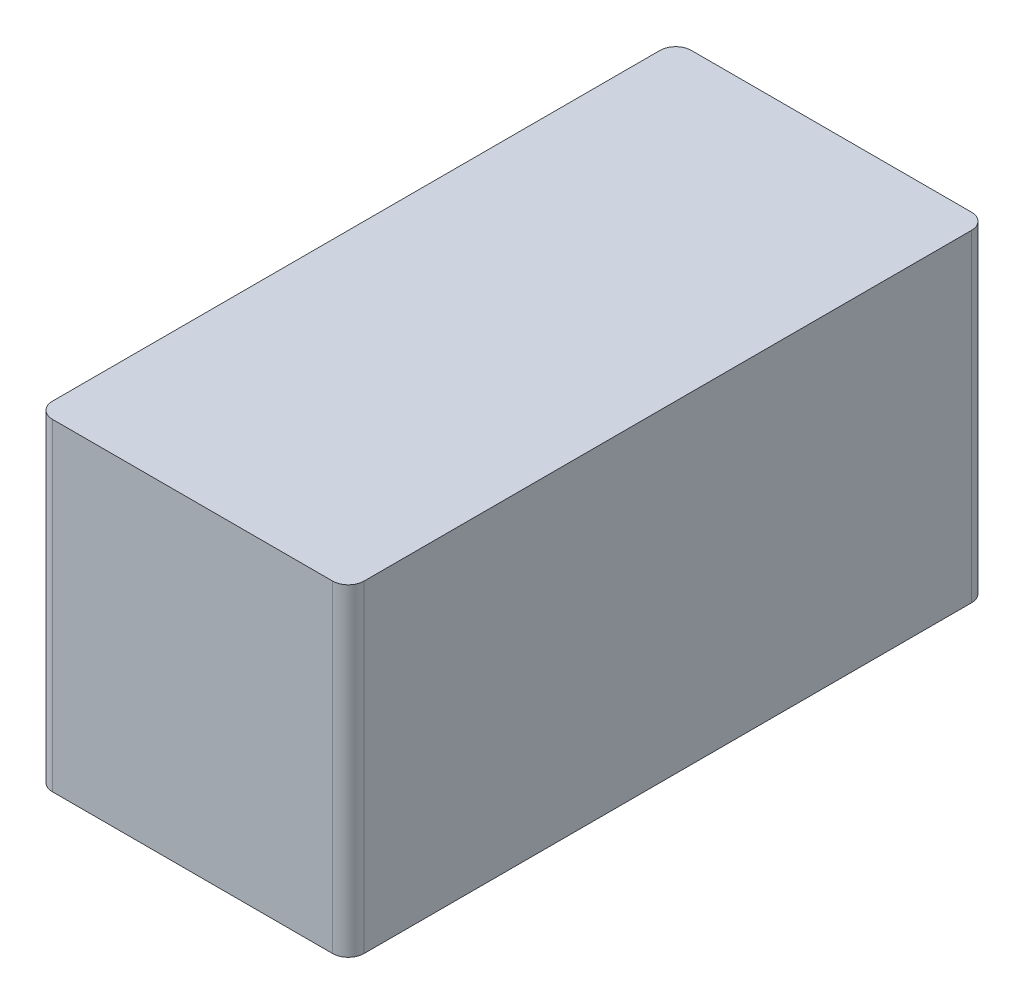
ISO-10303-21;
HEADER;
FILE_DESCRIPTION(('STEP AP214'),'2;1');
FILE_NAME('part.step','',(''),(''),'','','');
FILE_SCHEMA(('AUTOMOTIVE_DESIGN { 1 0 10303 214 1 1 1 1 }'));
ENDSEC;
DATA;
#1=APPLICATION_CONTEXT('core data for automotive mechanical design processes');
#2=APPLICATION_PROTOCOL_DEFINITION('international standard','automotive_design',2000,#1);
#3=PRODUCT_CONTEXT('',#1,'mechanical');
#4=PRODUCT('Part','Part','',(#3));
#5=PRODUCT_RELATED_PRODUCT_CATEGORY('part','',(#4));
#6=PRODUCT_DEFINITION_FORMATION('','',#4);
#7=PRODUCT_DEFINITION_CONTEXT('part definition',#1,'design');
#8=PRODUCT_DEFINITION('design','',#6,#7);
#9=PRODUCT_DEFINITION_SHAPE('','',#8);
#10=(LENGTH_UNIT() NAMED_UNIT(*) SI_UNIT(.MILLI.,.METRE.));
#11=(NAMED_UNIT(*) PLANE_ANGLE_UNIT() SI_UNIT($,.RADIAN.));
#12=(NAMED_UNIT(*) SI_UNIT($,.STERADIAN.) SOLID_ANGLE_UNIT());
#13=UNCERTAINTY_MEASURE_WITH_UNIT(LENGTH_MEASURE(1.E-05),#10,'distance_accuracy_value','');
#14=(GEOMETRIC_REPRESENTATION_CONTEXT(3) GLOBAL_UNCERTAINTY_ASSIGNED_CONTEXT((#13)) GLOBAL_UNIT_ASSIGNED_CONTEXT((#10,
#11,#12)) REPRESENTATION_CONTEXT('',''));
#15=CARTESIAN_POINT('',(0.,0.,0.));
#16=DIRECTION('',(0.,0.,1.));
#17=DIRECTION('',(1.,0.,0.));
#18=AXIS2_PLACEMENT_3D('',#15,#16,#17);
#19=CARTESIAN_POINT('',(9.9,10.25,-20.3));
#20=DIRECTION('',(-1.,0.,0.));
#21=DIRECTION('',(0.,0.,1.));
#22=AXIS2_PLACEMENT_3D('',#19,#20,#21);
#23=PLANE('',#22);
#24=DIRECTION('',(0.,0.,-1.));
#25=VECTOR('',#24,1.);
#26=CARTESIAN_POINT('',(9.9,-10.25,-20.3));
#27=LINE('',#26,#25);
#28=CARTESIAN_POINT('',(9.9,-10.25,19.3));
#29=VERTEX_POINT('',#28);
#30=CARTESIAN_POINT('',(9.9,-10.25,-19.3));
#31=VERTEX_POINT('',#30);
#32=EDGE_CURVE('E130',#29,#31,#27,.T.);
#33=ORIENTED_EDGE('',*,*,#32,.T.);
#34=DIRECTION('',(0.,-1.,0.));
#35=VECTOR('',#34,1.);
#36=CARTESIAN_POINT('',(9.9,10.25,-19.3));
#37=LINE('',#36,#35);
#38=CARTESIAN_POINT('',(9.9,10.25,-19.3));
#39=VERTEX_POINT('',#38);
#40=EDGE_CURVE('E153',#31,#39,#37,.F.);
#41=ORIENTED_EDGE('',*,*,#40,.T.);
#42=DIRECTION('',(0.,0.,-1.));
#43=VECTOR('',#42,1.);
#44=CARTESIAN_POINT('',(9.9,10.25,-20.3));
#45=LINE('',#44,#43);
#46=CARTESIAN_POINT('',(9.9,10.25,19.3));
#47=VERTEX_POINT('',#46);
#48=EDGE_CURVE('E128',#47,#39,#45,.T.);
#49=ORIENTED_EDGE('',*,*,#48,.F.);
#50=DIRECTION('',(0.,-1.,0.));
#51=VECTOR('',#50,1.);
#52=CARTESIAN_POINT('',(9.9,10.25,19.3));
#53=LINE('',#52,#51);
#54=EDGE_CURVE('E150',#47,#29,#53,.T.);
#55=ORIENTED_EDGE('',*,*,#54,.T.);
#56=EDGE_LOOP('',(#33,#41,#49,#55));
#57=FACE_BOUND('',#56,.T.);
#58=ADVANCED_FACE('F35',(#57),#23,.F.);
#59=CARTESIAN_POINT('',(-9.9,10.25,-20.3));
#60=DIRECTION('',(0.,0.,1.));
#61=DIRECTION('',(1.,0.,0.));
#62=AXIS2_PLACEMENT_3D('',#59,#60,#61);
#63=PLANE('',#62);
#64=DIRECTION('',(-1.,0.,0.));
#65=VECTOR('',#64,1.);
#66=CARTESIAN_POINT('',(-9.9,-10.25,-20.3));
#67=LINE('',#66,#65);
#68=CARTESIAN_POINT('',(8.9,-10.25,-20.3));
#69=VERTEX_POINT('',#68);
#70=CARTESIAN_POINT('',(-8.9,-10.25,-20.3));
#71=VERTEX_POINT('',#70);
#72=EDGE_CURVE('E126',#69,#71,#67,.T.);
#73=ORIENTED_EDGE('',*,*,#72,.T.);
#74=DIRECTION('',(0.,-1.,0.));
#75=VECTOR('',#74,1.);
#76=CARTESIAN_POINT('',(-8.9,10.25,-20.3));
#77=LINE('',#76,#75);
#78=CARTESIAN_POINT('',(-8.9,10.25,-20.3));
#79=VERTEX_POINT('',#78);
#80=EDGE_CURVE('E105',#71,#79,#77,.F.);
#81=ORIENTED_EDGE('',*,*,#80,.T.);
#82=DIRECTION('',(-1.,0.,0.));
#83=VECTOR('',#82,1.);
#84=CARTESIAN_POINT('',(-9.9,10.25,-20.3));
#85=LINE('',#84,#83);
#86=CARTESIAN_POINT('',(8.9,10.25,-20.3));
#87=VERTEX_POINT('',#86);
#88=EDGE_CURVE('E169',#87,#79,#85,.T.);
#89=ORIENTED_EDGE('',*,*,#88,.F.);
#90=DIRECTION('',(0.,-1.,0.));
#91=VECTOR('',#90,1.);
#92=CARTESIAN_POINT('',(8.9,10.25,-20.3));
#93=LINE('',#92,#91);
#94=EDGE_CURVE('E110',#87,#69,#93,.T.);
#95=ORIENTED_EDGE('',*,*,#94,.T.);
#96=EDGE_LOOP('',(#73,#81,#89,#95));
#97=FACE_BOUND('',#96,.T.);
#98=ADVANCED_FACE('F186',(#97),#63,.F.);
#99=CARTESIAN_POINT('',(-9.9,10.25,-20.3));
#100=DIRECTION('',(1.,0.,0.));
#101=DIRECTION('',(0.,0.,-1.));
#102=AXIS2_PLACEMENT_3D('',#99,#100,#101);
#103=PLANE('',#102);
#104=DIRECTION('',(0.,0.,1.));
#105=VECTOR('',#104,1.);
#106=CARTESIAN_POINT('',(-9.9,10.25,-20.3));
#107=LINE('',#106,#105);
#108=CARTESIAN_POINT('',(-9.9,10.25,-19.3));
#109=VERTEX_POINT('',#108);
#110=CARTESIAN_POINT('',(-9.9,10.25,19.3));
#111=VERTEX_POINT('',#110);
#112=EDGE_CURVE('E119',#109,#111,#107,.T.);
#113=ORIENTED_EDGE('',*,*,#112,.F.);
#114=DIRECTION('',(0.,-1.,0.));
#115=VECTOR('',#114,1.);
#116=CARTESIAN_POINT('',(-9.9,10.25,-19.3));
#117=LINE('',#116,#115);
#118=CARTESIAN_POINT('',(-9.9,-10.25,-19.3));
#119=VERTEX_POINT('',#118);
#120=EDGE_CURVE('E104',#109,#119,#117,.T.);
#121=ORIENTED_EDGE('',*,*,#120,.T.);
#122=DIRECTION('',(0.,0.,1.));
#123=VECTOR('',#122,1.);
#124=CARTESIAN_POINT('',(-9.9,-10.25,-20.3));
#125=LINE('',#124,#123);
#126=CARTESIAN_POINT('',(-9.9,-10.25,19.3));
#127=VERTEX_POINT('',#126);
#128=EDGE_CURVE('E117',#119,#127,#125,.T.);
#129=ORIENTED_EDGE('',*,*,#128,.T.);
#130=DIRECTION('',(0.,-1.,0.));
#131=VECTOR('',#130,1.);
#132=CARTESIAN_POINT('',(-9.9,10.25,19.3));
#133=LINE('',#132,#131);
#134=EDGE_CURVE('E121',#127,#111,#133,.F.);
#135=ORIENTED_EDGE('',*,*,#134,.T.);
#136=EDGE_LOOP('',(#113,#121,#129,#135));
#137=FACE_BOUND('',#136,.T.);
#138=ADVANCED_FACE('F116',(#137),#103,.F.);
#139=CARTESIAN_POINT('',(-9.9,10.25,20.3));
#140=DIRECTION('',(0.,0.,-1.));
#141=DIRECTION('',(-1.,0.,0.));
#142=AXIS2_PLACEMENT_3D('',#139,#140,#141);
#143=PLANE('',#142);
#144=DIRECTION('',(1.,0.,0.));
#145=VECTOR('',#144,1.);
#146=CARTESIAN_POINT('',(-9.9,-10.25,20.3));
#147=LINE('',#146,#145);
#148=CARTESIAN_POINT('',(-8.9,-10.25,20.3));
#149=VERTEX_POINT('',#148);
#150=CARTESIAN_POINT('',(8.90000000000001,-10.25,20.3));
#151=VERTEX_POINT('',#150);
#152=EDGE_CURVE('E125',#149,#151,#147,.T.);
#153=ORIENTED_EDGE('',*,*,#152,.T.);
#154=DIRECTION('',(0.,-1.,0.));
#155=VECTOR('',#154,1.);
#156=CARTESIAN_POINT('',(8.90000000000001,10.25,20.3));
#157=LINE('',#156,#155);
#158=CARTESIAN_POINT('',(8.90000000000001,10.25,20.3));
#159=VERTEX_POINT('',#158);
#160=EDGE_CURVE('E11',#151,#159,#157,.F.);
#161=ORIENTED_EDGE('',*,*,#160,.T.);
#162=DIRECTION('',(1.,0.,0.));
#163=VECTOR('',#162,1.);
#164=CARTESIAN_POINT('',(-9.9,10.25,20.3));
#165=LINE('',#164,#163);
#166=CARTESIAN_POINT('',(-8.9,10.25,20.3));
#167=VERTEX_POINT('',#166);
#168=EDGE_CURVE('E134',#167,#159,#165,.T.);
#169=ORIENTED_EDGE('',*,*,#168,.F.);
#170=DIRECTION('',(0.,-1.,0.));
#171=VECTOR('',#170,1.);
#172=CARTESIAN_POINT('',(-8.9,10.25,20.3));
#173=LINE('',#172,#171);
#174=EDGE_CURVE('E43',#167,#149,#173,.T.);
#175=ORIENTED_EDGE('',*,*,#174,.T.);
#176=EDGE_LOOP('',(#153,#161,#169,#175));
#177=FACE_BOUND('',#176,.T.);
#178=ADVANCED_FACE('F156',(#177),#143,.F.);
#179=CARTESIAN_POINT('',(0.,10.25,0.));
#180=DIRECTION('',(0.,1.,0.));
#181=DIRECTION('',(0.,0.,1.));
#182=AXIS2_PLACEMENT_3D('',#179,#180,#181);
#183=PLANE('',#182);
#184=ORIENTED_EDGE('',*,*,#88,.T.);
#185=CARTESIAN_POINT('',(-8.9,10.25,-19.3));
#186=DIRECTION('',(0.,1.,0.));
#187=DIRECTION('',(0.,0.,1.));
#188=AXIS2_PLACEMENT_3D('',#185,#186,#187);
#189=CIRCLE('',#188,1.);
#190=EDGE_CURVE('E148',#79,#109,#189,.T.);
#191=ORIENTED_EDGE('',*,*,#190,.T.);
#192=ORIENTED_EDGE('',*,*,#112,.T.);
#193=CARTESIAN_POINT('',(-8.9,10.25,19.3));
#194=DIRECTION('',(0.,1.,0.));
#195=DIRECTION('',(0.,0.,1.));
#196=AXIS2_PLACEMENT_3D('',#193,#194,#195);
#197=CIRCLE('',#196,1.);
#198=EDGE_CURVE('E55',#111,#167,#197,.T.);
#199=ORIENTED_EDGE('',*,*,#198,.T.);
#200=ORIENTED_EDGE('',*,*,#168,.T.);
#201=CARTESIAN_POINT('',(8.90000000000001,10.25,19.3));
#202=DIRECTION('',(0.,1.,0.));
#203=DIRECTION('',(0.,0.,1.));
#204=AXIS2_PLACEMENT_3D('',#201,#202,#203);
#205=CIRCLE('',#204,1.);
#206=EDGE_CURVE('E144',#159,#47,#205,.T.);
#207=ORIENTED_EDGE('',*,*,#206,.T.);
#208=ORIENTED_EDGE('',*,*,#48,.T.);
#209=CARTESIAN_POINT('',(8.9,10.25,-19.3));
#210=DIRECTION('',(0.,1.,0.));
#211=DIRECTION('',(0.,0.,1.));
#212=AXIS2_PLACEMENT_3D('',#209,#210,#211);
#213=CIRCLE('',#212,1.);
#214=EDGE_CURVE('E146',#39,#87,#213,.T.);
#215=ORIENTED_EDGE('',*,*,#214,.T.);
#216=EDGE_LOOP('',(#184,#191,#192,#199,#200,#207,#208,#215));
#217=FACE_BOUND('',#216,.T.);
#218=ADVANCED_FACE('F175',(#217),#183,.T.);
#219=CARTESIAN_POINT('',(0.,-10.25,0.));
#220=DIRECTION('',(0.,1.,0.));
#221=DIRECTION('',(0.,0.,1.));
#222=AXIS2_PLACEMENT_3D('',#219,#220,#221);
#223=PLANE('',#222);
#224=ORIENTED_EDGE('',*,*,#128,.F.);
#225=CARTESIAN_POINT('',(-8.9,-10.25,-19.3));
#226=DIRECTION('',(0.,1.,0.));
#227=DIRECTION('',(0.,0.,1.));
#228=AXIS2_PLACEMENT_3D('',#225,#226,#227);
#229=CIRCLE('',#228,1.);
#230=EDGE_CURVE('E100',#119,#71,#229,.F.);
#231=ORIENTED_EDGE('',*,*,#230,.T.);
#232=ORIENTED_EDGE('',*,*,#72,.F.);
#233=CARTESIAN_POINT('',(8.9,-10.25,-19.3));
#234=DIRECTION('',(0.,1.,0.));
#235=DIRECTION('',(0.,0.,1.));
#236=AXIS2_PLACEMENT_3D('',#233,#234,#235);
#237=CIRCLE('',#236,1.);
#238=EDGE_CURVE('E111',#69,#31,#237,.F.);
#239=ORIENTED_EDGE('',*,*,#238,.T.);
#240=ORIENTED_EDGE('',*,*,#32,.F.);
#241=CARTESIAN_POINT('',(8.90000000000001,-10.25,19.3));
#242=DIRECTION('',(0.,1.,0.));
#243=DIRECTION('',(0.,0.,1.));
#244=AXIS2_PLACEMENT_3D('',#241,#242,#243);
#245=CIRCLE('',#244,1.);
#246=EDGE_CURVE('E137',#29,#151,#245,.F.);
#247=ORIENTED_EDGE('',*,*,#246,.T.);
#248=ORIENTED_EDGE('',*,*,#152,.F.);
#249=CARTESIAN_POINT('',(-8.9,-10.25,19.3));
#250=DIRECTION('',(0.,1.,0.));
#251=DIRECTION('',(0.,0.,1.));
#252=AXIS2_PLACEMENT_3D('',#249,#250,#251);
#253=CIRCLE('',#252,1.);
#254=EDGE_CURVE('E120',#149,#127,#253,.F.);
#255=ORIENTED_EDGE('',*,*,#254,.T.);
#256=EDGE_LOOP('',(#224,#231,#232,#239,#240,#247,#248,#255));
#257=FACE_BOUND('',#256,.T.);
#258=ADVANCED_FACE('F123',(#257),#223,.F.);
#259=CARTESIAN_POINT('',(-8.9,10.25,-19.3));
#260=DIRECTION('',(0.,-1.,0.));
#261=DIRECTION('',(0.,0.,-1.));
#262=AXIS2_PLACEMENT_3D('',#259,#260,#261);
#263=CYLINDRICAL_SURFACE('',#262,1.);
#264=ORIENTED_EDGE('',*,*,#190,.F.);
#265=ORIENTED_EDGE('',*,*,#80,.F.);
#266=ORIENTED_EDGE('',*,*,#230,.F.);
#267=ORIENTED_EDGE('',*,*,#120,.F.);
#268=EDGE_LOOP('',(#264,#265,#266,#267));
#269=FACE_BOUND('',#268,.T.);
#270=ADVANCED_FACE('F103',(#269),#263,.T.);
#271=CARTESIAN_POINT('',(8.9,10.25,-19.3));
#272=DIRECTION('',(0.,-1.,0.));
#273=DIRECTION('',(0.,0.,-1.));
#274=AXIS2_PLACEMENT_3D('',#271,#272,#273);
#275=CYLINDRICAL_SURFACE('',#274,1.);
#276=ORIENTED_EDGE('',*,*,#214,.F.);
#277=ORIENTED_EDGE('',*,*,#40,.F.);
#278=ORIENTED_EDGE('',*,*,#238,.F.);
#279=ORIENTED_EDGE('',*,*,#94,.F.);
#280=EDGE_LOOP('',(#276,#277,#278,#279));
#281=FACE_BOUND('',#280,.T.);
#282=ADVANCED_FACE('F197',(#281),#275,.T.);
#283=CARTESIAN_POINT('',(8.90000000000001,10.25,19.3));
#284=DIRECTION('',(0.,-1.,0.));
#285=DIRECTION('',(0.,0.,-1.));
#286=AXIS2_PLACEMENT_3D('',#283,#284,#285);
#287=CYLINDRICAL_SURFACE('',#286,1.);
#288=ORIENTED_EDGE('',*,*,#206,.F.);
#289=ORIENTED_EDGE('',*,*,#160,.F.);
#290=ORIENTED_EDGE('',*,*,#246,.F.);
#291=ORIENTED_EDGE('',*,*,#54,.F.);
#292=EDGE_LOOP('',(#288,#289,#290,#291));
#293=FACE_BOUND('',#292,.T.);
#294=ADVANCED_FACE('F163',(#293),#287,.T.);
#295=CARTESIAN_POINT('',(-8.9,10.25,19.3));
#296=DIRECTION('',(0.,-1.,0.));
#297=DIRECTION('',(0.,0.,-1.));
#298=AXIS2_PLACEMENT_3D('',#295,#296,#297);
#299=CYLINDRICAL_SURFACE('',#298,1.);
#300=ORIENTED_EDGE('',*,*,#198,.F.);
#301=ORIENTED_EDGE('',*,*,#134,.F.);
#302=ORIENTED_EDGE('',*,*,#254,.F.);
#303=ORIENTED_EDGE('',*,*,#174,.F.);
#304=EDGE_LOOP('',(#300,#301,#302,#303));
#305=FACE_BOUND('',#304,.T.);
#306=ADVANCED_FACE('F37',(#305),#299,.T.);
#307=CLOSED_SHELL('',(#58,#98,#138,#178,#218,#258,#270,#282,#294,#306));
#308=MANIFOLD_SOLID_BREP('B2',#307);
#309=ADVANCED_BREP_SHAPE_REPRESENTATION('',(#18,#308),#14);
#310=SHAPE_DEFINITION_REPRESENTATION(#9,#309);
ENDSEC;
END-ISO-10303-21;
